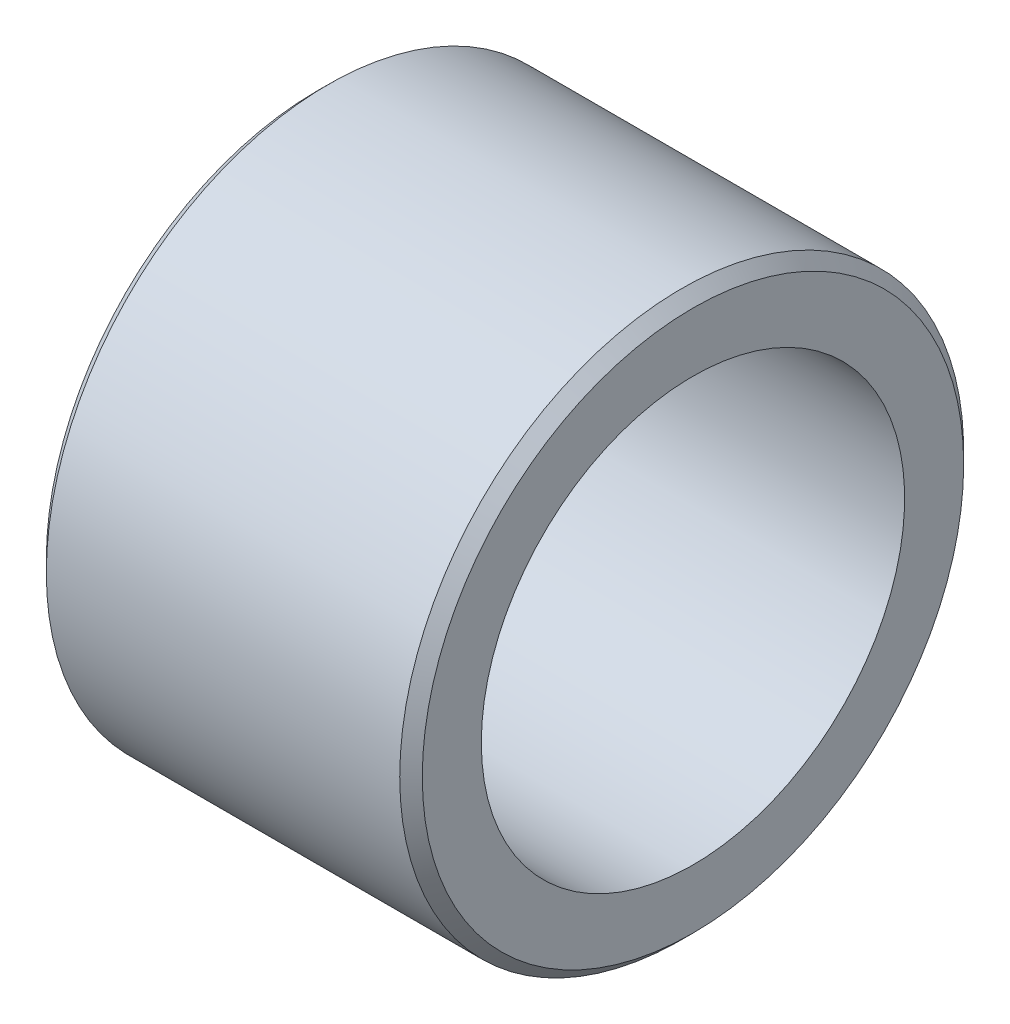
ISO-10303-21;
HEADER;
FILE_DESCRIPTION(('STEP AP214'),'2;1');
FILE_NAME('part.step','',(''),(''),'','','');
FILE_SCHEMA(('AUTOMOTIVE_DESIGN { 1 0 10303 214 1 1 1 1 }'));
ENDSEC;
DATA;
#1=APPLICATION_CONTEXT('core data for automotive mechanical design processes');
#2=APPLICATION_PROTOCOL_DEFINITION('international standard','automotive_design',2000,#1);
#3=PRODUCT_CONTEXT('',#1,'mechanical');
#4=PRODUCT('Part','Part','',(#3));
#5=PRODUCT_RELATED_PRODUCT_CATEGORY('part','',(#4));
#6=PRODUCT_DEFINITION_FORMATION('','',#4);
#7=PRODUCT_DEFINITION_CONTEXT('part definition',#1,'design');
#8=PRODUCT_DEFINITION('design','',#6,#7);
#9=PRODUCT_DEFINITION_SHAPE('','',#8);
#10=(LENGTH_UNIT() NAMED_UNIT(*) SI_UNIT(.MILLI.,.METRE.));
#11=(NAMED_UNIT(*) PLANE_ANGLE_UNIT() SI_UNIT($,.RADIAN.));
#12=(NAMED_UNIT(*) SI_UNIT($,.STERADIAN.) SOLID_ANGLE_UNIT());
#13=UNCERTAINTY_MEASURE_WITH_UNIT(LENGTH_MEASURE(1.E-05),#10,'distance_accuracy_value','');
#14=(GEOMETRIC_REPRESENTATION_CONTEXT(3) GLOBAL_UNCERTAINTY_ASSIGNED_CONTEXT((#13)) GLOBAL_UNIT_ASSIGNED_CONTEXT((#10,
#11,#12)) REPRESENTATION_CONTEXT('',''));
#15=CARTESIAN_POINT('',(0.,0.,0.));
#16=DIRECTION('',(0.,0.,1.));
#17=DIRECTION('',(1.,0.,0.));
#18=AXIS2_PLACEMENT_3D('',#15,#16,#17);
#19=CARTESIAN_POINT('',(12.7,7.1501,0.));
#20=DIRECTION('',(-1.,0.,0.));
#21=DIRECTION('',(0.,0.,1.));
#22=AXIS2_PLACEMENT_3D('',#19,#20,#21);
#23=PLANE('',#22);
#24=CARTESIAN_POINT('',(12.7,0.,0.));
#25=DIRECTION('',(-1.,0.,0.));
#26=DIRECTION('',(0.,0.,1.));
#27=AXIS2_PLACEMENT_3D('',#24,#25,#26);
#28=CIRCLE('',#27,9.14399999999999);
#29=CARTESIAN_POINT('',(12.7,0.,9.14399999999999));
#30=VERTEX_POINT('',#29);
#31=EDGE_CURVE('E10',#30,#30,#28,.F.);
#32=ORIENTED_EDGE('',*,*,#31,.T.);
#33=EDGE_LOOP('',(#32));
#34=FACE_BOUND('',#33,.T.);
#35=CARTESIAN_POINT('',(12.7,0.,0.));
#36=DIRECTION('',(-1.,0.,0.));
#37=DIRECTION('',(0.,0.,1.));
#38=AXIS2_PLACEMENT_3D('',#35,#36,#37);
#39=CIRCLE('',#38,7.1501);
#40=CARTESIAN_POINT('',(12.7,0.,7.1501));
#41=VERTEX_POINT('',#40);
#42=EDGE_CURVE('E54',#41,#41,#39,.T.);
#43=ORIENTED_EDGE('',*,*,#42,.T.);
#44=EDGE_LOOP('',(#43));
#45=FACE_BOUND('',#44,.T.);
#46=ADVANCED_FACE('F34',(#34,#45),#23,.F.);
#47=CARTESIAN_POINT('',(0.,0.,0.));
#48=DIRECTION('',(-1.,0.,0.));
#49=DIRECTION('',(0.,0.,1.));
#50=AXIS2_PLACEMENT_3D('',#47,#48,#49);
#51=CYLINDRICAL_SURFACE('',#50,7.1501);
#52=ORIENTED_EDGE('',*,*,#42,.F.);
#53=EDGE_LOOP('',(#52));
#54=FACE_BOUND('',#53,.T.);
#55=CARTESIAN_POINT('',(0.,0.,0.));
#56=DIRECTION('',(-1.,0.,0.));
#57=DIRECTION('',(0.,0.,1.));
#58=AXIS2_PLACEMENT_3D('',#55,#56,#57);
#59=CIRCLE('',#58,7.1501);
#60=CARTESIAN_POINT('',(0.,0.,7.1501));
#61=VERTEX_POINT('',#60);
#62=EDGE_CURVE('E57',#61,#61,#59,.T.);
#63=ORIENTED_EDGE('',*,*,#62,.T.);
#64=EDGE_LOOP('',(#63));
#65=FACE_BOUND('',#64,.T.);
#66=ADVANCED_FACE('F61',(#54,#65),#51,.F.);
#67=CARTESIAN_POINT('',(0.,7.1501,0.));
#68=DIRECTION('',(1.,0.,0.));
#69=DIRECTION('',(0.,0.,-1.));
#70=AXIS2_PLACEMENT_3D('',#67,#68,#69);
#71=PLANE('',#70);
#72=CARTESIAN_POINT('',(0.,0.,0.));
#73=DIRECTION('',(1.,0.,0.));
#74=DIRECTION('',(0.,0.,-1.));
#75=AXIS2_PLACEMENT_3D('',#72,#73,#74);
#76=CIRCLE('',#75,9.14400000000001);
#77=CARTESIAN_POINT('',(0.,0.,-9.14400000000001));
#78=VERTEX_POINT('',#77);
#79=EDGE_CURVE('E49',#78,#78,#76,.F.);
#80=ORIENTED_EDGE('',*,*,#79,.T.);
#81=EDGE_LOOP('',(#80));
#82=FACE_BOUND('',#81,.T.);
#83=ORIENTED_EDGE('',*,*,#62,.F.);
#84=EDGE_LOOP('',(#83));
#85=FACE_BOUND('',#84,.T.);
#86=ADVANCED_FACE('F63',(#82,#85),#71,.F.);
#87=CARTESIAN_POINT('',(0.,0.,0.));
#88=DIRECTION('',(-1.,0.,0.));
#89=DIRECTION('',(0.,0.,1.));
#90=AXIS2_PLACEMENT_3D('',#87,#88,#89);
#91=CYLINDRICAL_SURFACE('',#90,9.525);
#92=CARTESIAN_POINT('',(0.380999999999998,0.,0.));
#93=DIRECTION('',(1.,0.,0.));
#94=DIRECTION('',(0.,0.,-1.));
#95=AXIS2_PLACEMENT_3D('',#92,#93,#94);
#96=CIRCLE('',#95,9.525);
#97=CARTESIAN_POINT('',(0.380999999999998,0.,-9.525));
#98=VERTEX_POINT('',#97);
#99=EDGE_CURVE('E41',#98,#98,#96,.T.);
#100=ORIENTED_EDGE('',*,*,#99,.T.);
#101=EDGE_LOOP('',(#100));
#102=FACE_BOUND('',#101,.T.);
#103=CARTESIAN_POINT('',(12.319,0.,0.));
#104=DIRECTION('',(-1.,0.,0.));
#105=DIRECTION('',(0.,0.,1.));
#106=AXIS2_PLACEMENT_3D('',#103,#104,#105);
#107=CIRCLE('',#106,9.525);
#108=CARTESIAN_POINT('',(12.319,0.,9.525));
#109=VERTEX_POINT('',#108);
#110=EDGE_CURVE('E45',#109,#109,#107,.T.);
#111=ORIENTED_EDGE('',*,*,#110,.T.);
#112=EDGE_LOOP('',(#111));
#113=FACE_BOUND('',#112,.T.);
#114=ADVANCED_FACE('F65',(#102,#113),#91,.T.);
#115=CARTESIAN_POINT('',(0.,0.,0.));
#116=DIRECTION('',(1.,0.,0.));
#117=DIRECTION('',(0.,0.,-1.));
#118=AXIS2_PLACEMENT_3D('',#115,#116,#117);
#119=CONICAL_SURFACE('',#118,9.14400000000001,0.785398163397444);
#120=ORIENTED_EDGE('',*,*,#99,.F.);
#121=EDGE_LOOP('',(#120));
#122=FACE_BOUND('',#121,.T.);
#123=ORIENTED_EDGE('',*,*,#79,.F.);
#124=EDGE_LOOP('',(#123));
#125=FACE_BOUND('',#124,.T.);
#126=ADVANCED_FACE('F72',(#122,#125),#119,.T.);
#127=CARTESIAN_POINT('',(12.319,0.,0.));
#128=DIRECTION('',(-1.,0.,0.));
#129=DIRECTION('',(0.,0.,1.));
#130=AXIS2_PLACEMENT_3D('',#127,#128,#129);
#131=CONICAL_SURFACE('',#130,9.525,0.785398163397451);
#132=ORIENTED_EDGE('',*,*,#31,.F.);
#133=EDGE_LOOP('',(#132));
#134=FACE_BOUND('',#133,.T.);
#135=ORIENTED_EDGE('',*,*,#110,.F.);
#136=EDGE_LOOP('',(#135));
#137=FACE_BOUND('',#136,.T.);
#138=ADVANCED_FACE('F36',(#134,#137),#131,.T.);
#139=CLOSED_SHELL('',(#46,#66,#86,#114,#126,#138));
#140=MANIFOLD_SOLID_BREP('B2',#139);
#141=ADVANCED_BREP_SHAPE_REPRESENTATION('',(#18,#140),#14);
#142=SHAPE_DEFINITION_REPRESENTATION(#9,#141);
ENDSEC;
END-ISO-10303-21;
